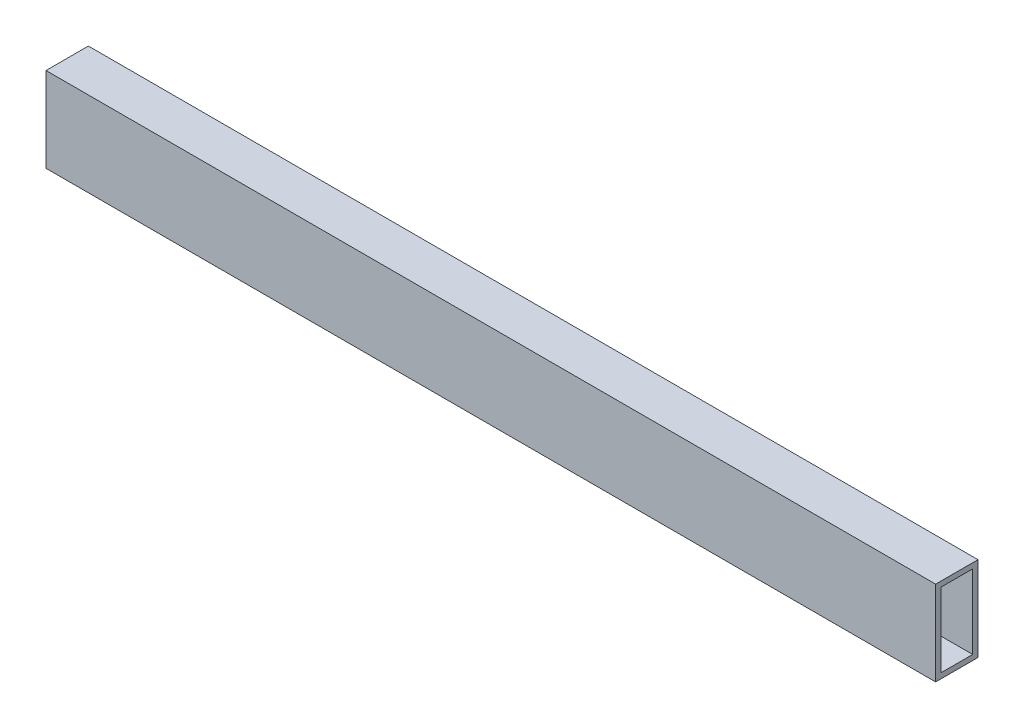
ISO-10303-21;
HEADER;
FILE_DESCRIPTION(('STEP AP214'),'2;1');
FILE_NAME('part.step','',(''),(''),'','','');
FILE_SCHEMA(('AUTOMOTIVE_DESIGN { 1 0 10303 214 1 1 1 1 }'));
ENDSEC;
DATA;
#1=APPLICATION_CONTEXT('core data for automotive mechanical design processes');
#2=APPLICATION_PROTOCOL_DEFINITION('international standard','automotive_design',2000,#1);
#3=PRODUCT_CONTEXT('',#1,'mechanical');
#4=PRODUCT('Part','Part','',(#3));
#5=PRODUCT_RELATED_PRODUCT_CATEGORY('part','',(#4));
#6=PRODUCT_DEFINITION_FORMATION('','',#4);
#7=PRODUCT_DEFINITION_CONTEXT('part definition',#1,'design');
#8=PRODUCT_DEFINITION('design','',#6,#7);
#9=PRODUCT_DEFINITION_SHAPE('','',#8);
#10=(LENGTH_UNIT() NAMED_UNIT(*) SI_UNIT(.MILLI.,.METRE.));
#11=(NAMED_UNIT(*) PLANE_ANGLE_UNIT() SI_UNIT($,.RADIAN.));
#12=(NAMED_UNIT(*) SI_UNIT($,.STERADIAN.) SOLID_ANGLE_UNIT());
#13=UNCERTAINTY_MEASURE_WITH_UNIT(LENGTH_MEASURE(1.E-05),#10,'distance_accuracy_value','');
#14=(GEOMETRIC_REPRESENTATION_CONTEXT(3) GLOBAL_UNCERTAINTY_ASSIGNED_CONTEXT((#13)) GLOBAL_UNIT_ASSIGNED_CONTEXT((#10,
#11,#12)) REPRESENTATION_CONTEXT('',''));
#15=CARTESIAN_POINT('',(0.,0.,0.));
#16=DIRECTION('',(0.,0.,1.));
#17=DIRECTION('',(1.,0.,0.));
#18=AXIS2_PLACEMENT_3D('',#15,#16,#17);
#19=CARTESIAN_POINT('',(266.7,0.,0.));
#20=DIRECTION('',(1.,0.,0.));
#21=DIRECTION('',(0.,0.,-1.));
#22=AXIS2_PLACEMENT_3D('',#19,#20,#21);
#23=PLANE('',#22);
#24=DIRECTION('',(0.,1.,0.));
#25=VECTOR('',#24,1.);
#26=CARTESIAN_POINT('',(266.7,-25.3999999999999,330.2));
#27=LINE('',#26,#25);
#28=CARTESIAN_POINT('',(266.7,-25.3999999999999,330.2));
#29=VERTEX_POINT('',#28);
#30=CARTESIAN_POINT('',(266.7,25.4,330.2));
#31=VERTEX_POINT('',#30);
#32=EDGE_CURVE('E149',#29,#31,#27,.T.);
#33=ORIENTED_EDGE('',*,*,#32,.T.);
#34=DIRECTION('',(0.,0.,1.));
#35=VECTOR('',#34,1.);
#36=CARTESIAN_POINT('',(266.7,25.4,330.2));
#37=LINE('',#36,#35);
#38=CARTESIAN_POINT('',(266.7,25.4,355.6));
#39=VERTEX_POINT('',#38);
#40=EDGE_CURVE('E151',#31,#39,#37,.T.);
#41=ORIENTED_EDGE('',*,*,#40,.T.);
#42=DIRECTION('',(0.,-1.,0.));
#43=VECTOR('',#42,1.);
#44=CARTESIAN_POINT('',(266.7,-25.3999999999999,355.6));
#45=LINE('',#44,#43);
#46=CARTESIAN_POINT('',(266.7,-25.3999999999999,355.6));
#47=VERTEX_POINT('',#46);
#48=EDGE_CURVE('E153',#39,#47,#45,.T.);
#49=ORIENTED_EDGE('',*,*,#48,.T.);
#50=DIRECTION('',(0.,0.,-1.));
#51=VECTOR('',#50,1.);
#52=CARTESIAN_POINT('',(266.7,-25.3999999999999,330.2));
#53=LINE('',#52,#51);
#54=EDGE_CURVE('E57',#47,#29,#53,.T.);
#55=ORIENTED_EDGE('',*,*,#54,.T.);
#56=EDGE_LOOP('',(#33,#41,#49,#55));
#57=FACE_BOUND('',#56,.T.);
#58=DIRECTION('',(0.,0.,1.));
#59=VECTOR('',#58,1.);
#60=CARTESIAN_POINT('',(266.7,22.225,333.375));
#61=LINE('',#60,#59);
#62=CARTESIAN_POINT('',(266.7,22.225,333.375));
#63=VERTEX_POINT('',#62);
#64=CARTESIAN_POINT('',(266.7,22.225,352.425));
#65=VERTEX_POINT('',#64);
#66=EDGE_CURVE('E140',#63,#65,#61,.T.);
#67=ORIENTED_EDGE('',*,*,#66,.F.);
#68=DIRECTION('',(0.,1.,0.));
#69=VECTOR('',#68,1.);
#70=CARTESIAN_POINT('',(266.7,-22.2249999999999,333.375));
#71=LINE('',#70,#69);
#72=CARTESIAN_POINT('',(266.7,-22.2249999999999,333.375));
#73=VERTEX_POINT('',#72);
#74=EDGE_CURVE('E138',#73,#63,#71,.T.);
#75=ORIENTED_EDGE('',*,*,#74,.F.);
#76=DIRECTION('',(0.,0.,-1.));
#77=VECTOR('',#76,1.);
#78=CARTESIAN_POINT('',(266.7,-22.2249999999999,333.375));
#79=LINE('',#78,#77);
#80=CARTESIAN_POINT('',(266.7,-22.2249999999999,352.425));
#81=VERTEX_POINT('',#80);
#82=EDGE_CURVE('E104',#81,#73,#79,.T.);
#83=ORIENTED_EDGE('',*,*,#82,.F.);
#84=DIRECTION('',(0.,-1.,0.));
#85=VECTOR('',#84,1.);
#86=CARTESIAN_POINT('',(266.7,-22.2249999999999,352.425));
#87=LINE('',#86,#85);
#88=EDGE_CURVE('E142',#65,#81,#87,.T.);
#89=ORIENTED_EDGE('',*,*,#88,.F.);
#90=EDGE_LOOP('',(#67,#75,#83,#89));
#91=FACE_BOUND('',#90,.T.);
#92=ADVANCED_FACE('F34',(#57,#91),#23,.T.);
#93=CARTESIAN_POINT('',(266.7,-25.3999999999999,330.2));
#94=DIRECTION('',(0.,0.,1.));
#95=DIRECTION('',(0.,-1.,0.));
#96=AXIS2_PLACEMENT_3D('',#93,#94,#95);
#97=PLANE('',#96);
#98=DIRECTION('',(-1.,0.,0.));
#99=VECTOR('',#98,1.);
#100=CARTESIAN_POINT('',(266.7,-25.3999999999999,330.2));
#101=LINE('',#100,#99);
#102=CARTESIAN_POINT('',(-266.7,-25.3999999999999,330.2));
#103=VERTEX_POINT('',#102);
#104=EDGE_CURVE('E156',#29,#103,#101,.T.);
#105=ORIENTED_EDGE('',*,*,#104,.T.);
#106=DIRECTION('',(0.,1.,0.));
#107=VECTOR('',#106,1.);
#108=CARTESIAN_POINT('',(-266.7,-25.3999999999999,330.2));
#109=LINE('',#108,#107);
#110=CARTESIAN_POINT('',(-266.7,25.4,330.2));
#111=VERTEX_POINT('',#110);
#112=EDGE_CURVE('E126',#103,#111,#109,.T.);
#113=ORIENTED_EDGE('',*,*,#112,.T.);
#114=DIRECTION('',(-1.,0.,0.));
#115=VECTOR('',#114,1.);
#116=CARTESIAN_POINT('',(266.7,25.4,330.2));
#117=LINE('',#116,#115);
#118=EDGE_CURVE('E11',#31,#111,#117,.T.);
#119=ORIENTED_EDGE('',*,*,#118,.F.);
#120=ORIENTED_EDGE('',*,*,#32,.F.);
#121=EDGE_LOOP('',(#105,#113,#119,#120));
#122=FACE_BOUND('',#121,.T.);
#123=ADVANCED_FACE('F36',(#122),#97,.F.);
#124=CARTESIAN_POINT('',(266.7,25.4,330.2));
#125=DIRECTION('',(0.,-1.,0.));
#126=DIRECTION('',(0.,0.,-1.));
#127=AXIS2_PLACEMENT_3D('',#124,#125,#126);
#128=PLANE('',#127);
#129=ORIENTED_EDGE('',*,*,#118,.T.);
#130=DIRECTION('',(0.,0.,1.));
#131=VECTOR('',#130,1.);
#132=CARTESIAN_POINT('',(-266.7,25.4,330.2));
#133=LINE('',#132,#131);
#134=CARTESIAN_POINT('',(-266.7,25.4,355.6));
#135=VERTEX_POINT('',#134);
#136=EDGE_CURVE('E135',#111,#135,#133,.T.);
#137=ORIENTED_EDGE('',*,*,#136,.T.);
#138=DIRECTION('',(-1.,0.,0.));
#139=VECTOR('',#138,1.);
#140=CARTESIAN_POINT('',(266.7,25.4,355.6));
#141=LINE('',#140,#139);
#142=EDGE_CURVE('E42',#39,#135,#141,.T.);
#143=ORIENTED_EDGE('',*,*,#142,.F.);
#144=ORIENTED_EDGE('',*,*,#40,.F.);
#145=EDGE_LOOP('',(#129,#137,#143,#144));
#146=FACE_BOUND('',#145,.T.);
#147=ADVANCED_FACE('F169',(#146),#128,.F.);
#148=CARTESIAN_POINT('',(266.7,-25.3999999999999,355.6));
#149=DIRECTION('',(0.,0.,-1.));
#150=DIRECTION('',(-1.,0.,0.));
#151=AXIS2_PLACEMENT_3D('',#148,#149,#150);
#152=PLANE('',#151);
#153=ORIENTED_EDGE('',*,*,#142,.T.);
#154=DIRECTION('',(0.,-1.,0.));
#155=VECTOR('',#154,1.);
#156=CARTESIAN_POINT('',(-266.7,-25.3999999999999,355.6));
#157=LINE('',#156,#155);
#158=CARTESIAN_POINT('',(-266.7,-25.3999999999999,355.6));
#159=VERTEX_POINT('',#158);
#160=EDGE_CURVE('E132',#135,#159,#157,.T.);
#161=ORIENTED_EDGE('',*,*,#160,.T.);
#162=DIRECTION('',(-1.,0.,0.));
#163=VECTOR('',#162,1.);
#164=CARTESIAN_POINT('',(266.7,-25.3999999999999,355.6));
#165=LINE('',#164,#163);
#166=EDGE_CURVE('E158',#47,#159,#165,.T.);
#167=ORIENTED_EDGE('',*,*,#166,.F.);
#168=ORIENTED_EDGE('',*,*,#48,.F.);
#169=EDGE_LOOP('',(#153,#161,#167,#168));
#170=FACE_BOUND('',#169,.T.);
#171=ADVANCED_FACE('F163',(#170),#152,.F.);
#172=CARTESIAN_POINT('',(266.7,-25.3999999999999,330.2));
#173=DIRECTION('',(0.,1.,0.));
#174=DIRECTION('',(0.,0.,1.));
#175=AXIS2_PLACEMENT_3D('',#172,#173,#174);
#176=PLANE('',#175);
#177=ORIENTED_EDGE('',*,*,#166,.T.);
#178=DIRECTION('',(0.,0.,-1.));
#179=VECTOR('',#178,1.);
#180=CARTESIAN_POINT('',(-266.7,-25.3999999999999,330.2));
#181=LINE('',#180,#179);
#182=EDGE_CURVE('E129',#159,#103,#181,.T.);
#183=ORIENTED_EDGE('',*,*,#182,.T.);
#184=ORIENTED_EDGE('',*,*,#104,.F.);
#185=ORIENTED_EDGE('',*,*,#54,.F.);
#186=EDGE_LOOP('',(#177,#183,#184,#185));
#187=FACE_BOUND('',#186,.T.);
#188=ADVANCED_FACE('F174',(#187),#176,.F.);
#189=CARTESIAN_POINT('',(266.7,-22.2249999999999,333.375));
#190=DIRECTION('',(0.,0.,1.));
#191=DIRECTION('',(1.,0.,0.));
#192=AXIS2_PLACEMENT_3D('',#189,#190,#191);
#193=PLANE('',#192);
#194=DIRECTION('',(-1.,0.,0.));
#195=VECTOR('',#194,1.);
#196=CARTESIAN_POINT('',(266.7,22.225,333.375));
#197=LINE('',#196,#195);
#198=CARTESIAN_POINT('',(-266.7,22.225,333.375));
#199=VERTEX_POINT('',#198);
#200=EDGE_CURVE('E112',#63,#199,#197,.T.);
#201=ORIENTED_EDGE('',*,*,#200,.T.);
#202=DIRECTION('',(0.,1.,0.));
#203=VECTOR('',#202,1.);
#204=CARTESIAN_POINT('',(-266.7,-22.2249999999999,333.375));
#205=LINE('',#204,#203);
#206=CARTESIAN_POINT('',(-266.7,-22.2249999999999,333.375));
#207=VERTEX_POINT('',#206);
#208=EDGE_CURVE('E109',#207,#199,#205,.T.);
#209=ORIENTED_EDGE('',*,*,#208,.F.);
#210=DIRECTION('',(-1.,0.,0.));
#211=VECTOR('',#210,1.);
#212=CARTESIAN_POINT('',(266.7,-22.2249999999999,333.375));
#213=LINE('',#212,#211);
#214=EDGE_CURVE('E97',#73,#207,#213,.T.);
#215=ORIENTED_EDGE('',*,*,#214,.F.);
#216=ORIENTED_EDGE('',*,*,#74,.T.);
#217=EDGE_LOOP('',(#201,#209,#215,#216));
#218=FACE_BOUND('',#217,.T.);
#219=ADVANCED_FACE('F110',(#218),#193,.T.);
#220=CARTESIAN_POINT('',(266.7,22.225,333.375));
#221=DIRECTION('',(0.,-1.,0.));
#222=DIRECTION('',(0.,0.,-1.));
#223=AXIS2_PLACEMENT_3D('',#220,#221,#222);
#224=PLANE('',#223);
#225=DIRECTION('',(-1.,0.,0.));
#226=VECTOR('',#225,1.);
#227=CARTESIAN_POINT('',(266.7,22.225,352.425));
#228=LINE('',#227,#226);
#229=CARTESIAN_POINT('',(-266.7,22.225,352.425));
#230=VERTEX_POINT('',#229);
#231=EDGE_CURVE('E146',#65,#230,#228,.T.);
#232=ORIENTED_EDGE('',*,*,#231,.T.);
#233=DIRECTION('',(0.,0.,1.));
#234=VECTOR('',#233,1.);
#235=CARTESIAN_POINT('',(-266.7,22.225,333.375));
#236=LINE('',#235,#234);
#237=EDGE_CURVE('E122',#199,#230,#236,.T.);
#238=ORIENTED_EDGE('',*,*,#237,.F.);
#239=ORIENTED_EDGE('',*,*,#200,.F.);
#240=ORIENTED_EDGE('',*,*,#66,.T.);
#241=EDGE_LOOP('',(#232,#238,#239,#240));
#242=FACE_BOUND('',#241,.T.);
#243=ADVANCED_FACE('F182',(#242),#224,.T.);
#244=CARTESIAN_POINT('',(266.7,-22.2249999999999,352.425));
#245=DIRECTION('',(0.,0.,-1.));
#246=DIRECTION('',(-1.,0.,0.));
#247=AXIS2_PLACEMENT_3D('',#244,#245,#246);
#248=PLANE('',#247);
#249=DIRECTION('',(-1.,0.,0.));
#250=VECTOR('',#249,1.);
#251=CARTESIAN_POINT('',(266.7,-22.2249999999999,352.425));
#252=LINE('',#251,#250);
#253=CARTESIAN_POINT('',(-266.7,-22.2249999999999,352.425));
#254=VERTEX_POINT('',#253);
#255=EDGE_CURVE('E49',#81,#254,#252,.T.);
#256=ORIENTED_EDGE('',*,*,#255,.T.);
#257=DIRECTION('',(0.,-1.,0.));
#258=VECTOR('',#257,1.);
#259=CARTESIAN_POINT('',(-266.7,-22.2249999999999,352.425));
#260=LINE('',#259,#258);
#261=EDGE_CURVE('E120',#230,#254,#260,.T.);
#262=ORIENTED_EDGE('',*,*,#261,.F.);
#263=ORIENTED_EDGE('',*,*,#231,.F.);
#264=ORIENTED_EDGE('',*,*,#88,.T.);
#265=EDGE_LOOP('',(#256,#262,#263,#264));
#266=FACE_BOUND('',#265,.T.);
#267=ADVANCED_FACE('F184',(#266),#248,.T.);
#268=CARTESIAN_POINT('',(266.7,-22.2249999999999,333.375));
#269=DIRECTION('',(0.,1.,0.));
#270=DIRECTION('',(0.,0.,1.));
#271=AXIS2_PLACEMENT_3D('',#268,#269,#270);
#272=PLANE('',#271);
#273=ORIENTED_EDGE('',*,*,#214,.T.);
#274=DIRECTION('',(0.,0.,-1.));
#275=VECTOR('',#274,1.);
#276=CARTESIAN_POINT('',(-266.7,-22.2249999999999,333.375));
#277=LINE('',#276,#275);
#278=EDGE_CURVE('E101',#254,#207,#277,.T.);
#279=ORIENTED_EDGE('',*,*,#278,.F.);
#280=ORIENTED_EDGE('',*,*,#255,.F.);
#281=ORIENTED_EDGE('',*,*,#82,.T.);
#282=EDGE_LOOP('',(#273,#279,#280,#281));
#283=FACE_BOUND('',#282,.T.);
#284=ADVANCED_FACE('F99',(#283),#272,.T.);
#285=CARTESIAN_POINT('',(-266.7,0.,0.));
#286=DIRECTION('',(-1.,0.,0.));
#287=DIRECTION('',(0.,0.,-1.));
#288=AXIS2_PLACEMENT_3D('',#285,#286,#287);
#289=PLANE('',#288);
#290=ORIENTED_EDGE('',*,*,#208,.T.);
#291=ORIENTED_EDGE('',*,*,#237,.T.);
#292=ORIENTED_EDGE('',*,*,#261,.T.);
#293=ORIENTED_EDGE('',*,*,#278,.T.);
#294=EDGE_LOOP('',(#290,#291,#292,#293));
#295=FACE_BOUND('',#294,.T.);
#296=ORIENTED_EDGE('',*,*,#112,.F.);
#297=ORIENTED_EDGE('',*,*,#182,.F.);
#298=ORIENTED_EDGE('',*,*,#160,.F.);
#299=ORIENTED_EDGE('',*,*,#136,.F.);
#300=EDGE_LOOP('',(#296,#297,#298,#299));
#301=FACE_BOUND('',#300,.T.);
#302=ADVANCED_FACE('F117',(#295,#301),#289,.T.);
#303=CLOSED_SHELL('',(#92,#123,#147,#171,#188,#219,#243,#267,#284,#302));
#304=MANIFOLD_SOLID_BREP('B2',#303);
#305=ADVANCED_BREP_SHAPE_REPRESENTATION('',(#18,#304),#14);
#306=SHAPE_DEFINITION_REPRESENTATION(#9,#305);
ENDSEC;
END-ISO-10303-21;
